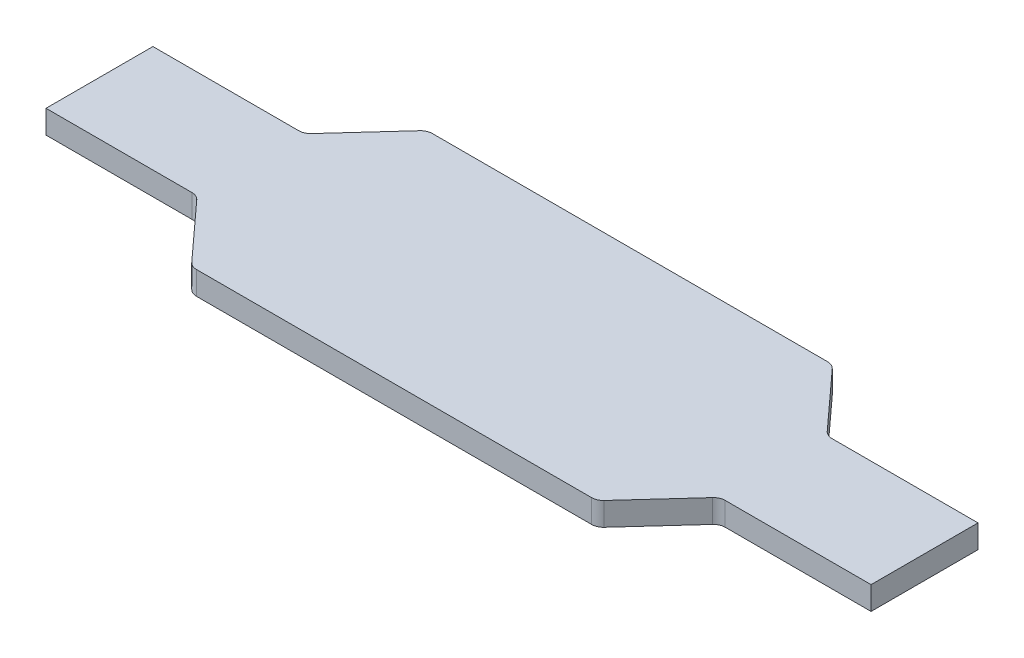
ISO-10303-21;
HEADER;
FILE_DESCRIPTION(('STEP AP214'),'2;1');
FILE_NAME('part.step','',(''),(''),'','','');
FILE_SCHEMA(('AUTOMOTIVE_DESIGN { 1 0 10303 214 1 1 1 1 }'));
ENDSEC;
DATA;
#1=APPLICATION_CONTEXT('core data for automotive mechanical design processes');
#2=APPLICATION_PROTOCOL_DEFINITION('international standard','automotive_design',2000,#1);
#3=PRODUCT_CONTEXT('',#1,'mechanical');
#4=PRODUCT('Part','Part','',(#3));
#5=PRODUCT_RELATED_PRODUCT_CATEGORY('part','',(#4));
#6=PRODUCT_DEFINITION_FORMATION('','',#4);
#7=PRODUCT_DEFINITION_CONTEXT('part definition',#1,'design');
#8=PRODUCT_DEFINITION('design','',#6,#7);
#9=PRODUCT_DEFINITION_SHAPE('','',#8);
#10=(LENGTH_UNIT() NAMED_UNIT(*) SI_UNIT(.MILLI.,.METRE.));
#11=(NAMED_UNIT(*) PLANE_ANGLE_UNIT() SI_UNIT($,.RADIAN.));
#12=(NAMED_UNIT(*) SI_UNIT($,.STERADIAN.) SOLID_ANGLE_UNIT());
#13=UNCERTAINTY_MEASURE_WITH_UNIT(LENGTH_MEASURE(1.E-05),#10,'distance_accuracy_value','');
#14=(GEOMETRIC_REPRESENTATION_CONTEXT(3) GLOBAL_UNCERTAINTY_ASSIGNED_CONTEXT((#13)) GLOBAL_UNIT_ASSIGNED_CONTEXT((#10,
#11,#12)) REPRESENTATION_CONTEXT('',''));
#15=CARTESIAN_POINT('',(0.,0.,0.));
#16=DIRECTION('',(0.,0.,1.));
#17=DIRECTION('',(1.,0.,0.));
#18=AXIS2_PLACEMENT_3D('',#15,#16,#17);
#19=CARTESIAN_POINT('',(-130.308370044053,10.,34.9855127088839));
#20=DIRECTION('',(0.,-1.,0.));
#21=DIRECTION('',(0.,0.,-1.));
#22=AXIS2_PLACEMENT_3D('',#19,#20,#21);
#23=CYLINDRICAL_SURFACE('',#22,4.99999999999999);
#24=CARTESIAN_POINT('',(-130.308370044053,0.,34.9855127088839));
#25=DIRECTION('',(0.,-1.,0.));
#26=DIRECTION('',(0.,0.,-1.));
#27=AXIS2_PLACEMENT_3D('',#24,#25,#26);
#28=CIRCLE('',#27,4.99999999999999);
#29=CARTESIAN_POINT('',(-130.308370044053,0.,39.9855127088839));
#30=VERTEX_POINT('',#29);
#31=CARTESIAN_POINT('',(-134.003500601569,0.,38.3538966185522));
#32=VERTEX_POINT('',#31);
#33=EDGE_CURVE('E215',#30,#32,#28,.T.);
#34=ORIENTED_EDGE('',*,*,#33,.F.);
#35=DIRECTION('',(0.,-1.,0.));
#36=VECTOR('',#35,1.);
#37=CARTESIAN_POINT('',(-130.308370044053,10.,39.9855127088839));
#38=LINE('',#37,#36);
#39=CARTESIAN_POINT('',(-130.308370044053,10.,39.9855127088839));
#40=VERTEX_POINT('',#39);
#41=EDGE_CURVE('E11',#40,#30,#38,.T.);
#42=ORIENTED_EDGE('',*,*,#41,.F.);
#43=CARTESIAN_POINT('',(-130.308370044053,10.,34.9855127088839));
#44=DIRECTION('',(0.,-1.,0.));
#45=DIRECTION('',(0.,0.,-1.));
#46=AXIS2_PLACEMENT_3D('',#43,#44,#45);
#47=CIRCLE('',#46,4.99999999999999);
#48=CARTESIAN_POINT('',(-134.003500601569,10.,38.3538966185522));
#49=VERTEX_POINT('',#48);
#50=EDGE_CURVE('E284',#40,#49,#47,.T.);
#51=ORIENTED_EDGE('',*,*,#50,.T.);
#52=DIRECTION('',(0.,-1.,0.));
#53=VECTOR('',#52,1.);
#54=CARTESIAN_POINT('',(-134.003500601569,10.,38.3538966185522));
#55=LINE('',#54,#53);
#56=EDGE_CURVE('E42',#49,#32,#55,.T.);
#57=ORIENTED_EDGE('',*,*,#56,.T.);
#58=EDGE_LOOP('',(#34,#42,#51,#57));
#59=FACE_BOUND('',#58,.T.);
#60=ADVANCED_FACE('F39',(#59),#23,.T.);
#61=CARTESIAN_POINT('',(-130.308370044053,10.,39.9855127088839));
#62=DIRECTION('',(0.,0.,-1.));
#63=DIRECTION('',(-1.,0.,0.));
#64=AXIS2_PLACEMENT_3D('',#61,#62,#63);
#65=PLANE('',#64);
#66=DIRECTION('',(1.,0.,0.));
#67=VECTOR('',#66,1.);
#68=CARTESIAN_POINT('',(-130.308370044053,0.,39.9855127088839));
#69=LINE('',#68,#67);
#70=CARTESIAN_POINT('',(39.6916299559471,0.,39.9855127088839));
#71=VERTEX_POINT('',#70);
#72=EDGE_CURVE('E121',#30,#71,#69,.T.);
#73=ORIENTED_EDGE('',*,*,#72,.T.);
#74=DIRECTION('',(0.,-1.,0.));
#75=VECTOR('',#74,1.);
#76=CARTESIAN_POINT('',(39.6916299559471,10.,39.9855127088839));
#77=LINE('',#76,#75);
#78=CARTESIAN_POINT('',(39.6916299559471,10.,39.9855127088839));
#79=VERTEX_POINT('',#78);
#80=EDGE_CURVE('E49',#79,#71,#77,.T.);
#81=ORIENTED_EDGE('',*,*,#80,.F.);
#82=DIRECTION('',(1.,0.,0.));
#83=VECTOR('',#82,1.);
#84=CARTESIAN_POINT('',(-130.308370044053,10.,39.9855127088839));
#85=LINE('',#84,#83);
#86=EDGE_CURVE('E188',#40,#79,#85,.T.);
#87=ORIENTED_EDGE('',*,*,#86,.F.);
#88=ORIENTED_EDGE('',*,*,#41,.T.);
#89=EDGE_LOOP('',(#73,#81,#87,#88));
#90=FACE_BOUND('',#89,.T.);
#91=ADVANCED_FACE('F470',(#90),#65,.F.);
#92=CARTESIAN_POINT('',(39.6916299559471,10.,34.9855127088839));
#93=DIRECTION('',(0.,-1.,0.));
#94=DIRECTION('',(0.,0.,-1.));
#95=AXIS2_PLACEMENT_3D('',#92,#93,#94);
#96=CYLINDRICAL_SURFACE('',#95,4.99999999999999);
#97=CARTESIAN_POINT('',(39.6916299559471,0.,34.9855127088839));
#98=DIRECTION('',(0.,1.,0.));
#99=DIRECTION('',(0.,0.,1.));
#100=AXIS2_PLACEMENT_3D('',#97,#98,#99);
#101=CIRCLE('',#100,4.99999999999999);
#102=CARTESIAN_POINT('',(43.386760513463,0.,38.3538966185523));
#103=VERTEX_POINT('',#102);
#104=EDGE_CURVE('E196',#71,#103,#101,.T.);
#105=ORIENTED_EDGE('',*,*,#104,.T.);
#106=DIRECTION('',(0.,-1.,0.));
#107=VECTOR('',#106,1.);
#108=CARTESIAN_POINT('',(43.386760513463,10.,38.3538966185523));
#109=LINE('',#108,#107);
#110=CARTESIAN_POINT('',(43.386760513463,10.,38.3538966185523));
#111=VERTEX_POINT('',#110);
#112=EDGE_CURVE('E193',#111,#103,#109,.T.);
#113=ORIENTED_EDGE('',*,*,#112,.F.);
#114=CARTESIAN_POINT('',(39.6916299559471,10.,34.9855127088839));
#115=DIRECTION('',(0.,1.,0.));
#116=DIRECTION('',(0.,0.,1.));
#117=AXIS2_PLACEMENT_3D('',#114,#115,#116);
#118=CIRCLE('',#117,4.99999999999999);
#119=EDGE_CURVE('E181',#79,#111,#118,.T.);
#120=ORIENTED_EDGE('',*,*,#119,.F.);
#121=ORIENTED_EDGE('',*,*,#80,.T.);
#122=EDGE_LOOP('',(#105,#113,#120,#121));
#123=FACE_BOUND('',#122,.T.);
#124=ADVANCED_FACE('F194',(#123),#96,.T.);
#125=CARTESIAN_POINT('',(43.386760513463,10.,38.3538966185522));
#126=DIRECTION('',(-0.739026111503173,0.,-0.673676781933665));
#127=DIRECTION('',(-0.673676781933665,0.,0.739026111503174));
#128=AXIS2_PLACEMENT_3D('',#125,#126,#127);
#129=PLANE('',#128);
#130=DIRECTION('',(0.673676781933665,0.,-0.739026111503173));
#131=VECTOR('',#130,1.);
#132=CARTESIAN_POINT('',(43.386760513463,0.,38.3538966185522));
#133=LINE('',#132,#131);
#134=CARTESIAN_POINT('',(65.6604900696769,0.,13.9195266297957));
#135=VERTEX_POINT('',#134);
#136=EDGE_CURVE('E278',#103,#135,#133,.T.);
#137=ORIENTED_EDGE('',*,*,#136,.T.);
#138=DIRECTION('',(0.,-1.,0.));
#139=VECTOR('',#138,1.);
#140=CARTESIAN_POINT('',(65.6604900696769,10.,13.9195266297957));
#141=LINE('',#140,#139);
#142=CARTESIAN_POINT('',(65.6604900696769,10.,13.9195266297957));
#143=VERTEX_POINT('',#142);
#144=EDGE_CURVE('E200',#143,#135,#141,.T.);
#145=ORIENTED_EDGE('',*,*,#144,.F.);
#146=DIRECTION('',(0.673676781933665,0.,-0.739026111503173));
#147=VECTOR('',#146,1.);
#148=CARTESIAN_POINT('',(43.386760513463,10.,38.3538966185522));
#149=LINE('',#148,#147);
#150=EDGE_CURVE('E186',#111,#143,#149,.T.);
#151=ORIENTED_EDGE('',*,*,#150,.F.);
#152=ORIENTED_EDGE('',*,*,#112,.T.);
#153=EDGE_LOOP('',(#137,#145,#151,#152));
#154=FACE_BOUND('',#153,.T.);
#155=ADVANCED_FACE('F202',(#154),#129,.F.);
#156=CARTESIAN_POINT('',(69.3556206271928,10.,17.287910539464));
#157=DIRECTION('',(0.,-1.,0.));
#158=DIRECTION('',(0.,0.,-1.));
#159=AXIS2_PLACEMENT_3D('',#156,#157,#158);
#160=CYLINDRICAL_SURFACE('',#159,5.00000000000001);
#161=CARTESIAN_POINT('',(69.3556206271928,0.,17.287910539464));
#162=DIRECTION('',(0.,-1.,0.));
#163=DIRECTION('',(0.,0.,-1.));
#164=AXIS2_PLACEMENT_3D('',#161,#162,#163);
#165=CIRCLE('',#164,5.00000000000001);
#166=CARTESIAN_POINT('',(69.3556206271928,0.,12.287910539464));
#167=VERTEX_POINT('',#166);
#168=EDGE_CURVE('E275',#135,#167,#165,.T.);
#169=ORIENTED_EDGE('',*,*,#168,.T.);
#170=DIRECTION('',(0.,-1.,0.));
#171=VECTOR('',#170,1.);
#172=CARTESIAN_POINT('',(69.3556206271928,10.,12.287910539464));
#173=LINE('',#172,#171);
#174=CARTESIAN_POINT('',(69.3556206271928,10.,12.287910539464));
#175=VERTEX_POINT('',#174);
#176=EDGE_CURVE('E290',#175,#167,#173,.T.);
#177=ORIENTED_EDGE('',*,*,#176,.F.);
#178=CARTESIAN_POINT('',(69.3556206271928,10.,17.287910539464));
#179=DIRECTION('',(0.,-1.,0.));
#180=DIRECTION('',(0.,0.,-1.));
#181=AXIS2_PLACEMENT_3D('',#178,#179,#180);
#182=CIRCLE('',#181,5.00000000000001);
#183=EDGE_CURVE('E206',#143,#175,#182,.T.);
#184=ORIENTED_EDGE('',*,*,#183,.F.);
#185=ORIENTED_EDGE('',*,*,#144,.T.);
#186=EDGE_LOOP('',(#169,#177,#184,#185));
#187=FACE_BOUND('',#186,.T.);
#188=ADVANCED_FACE('F346',(#187),#160,.F.);
#189=CARTESIAN_POINT('',(69.3556206271928,10.,12.287910539464));
#190=DIRECTION('',(0.,0.,-1.));
#191=DIRECTION('',(-1.,0.,0.));
#192=AXIS2_PLACEMENT_3D('',#189,#190,#191);
#193=PLANE('',#192);
#194=DIRECTION('',(1.,0.,0.));
#195=VECTOR('',#194,1.);
#196=CARTESIAN_POINT('',(69.3556206271928,0.,12.287910539464));
#197=LINE('',#196,#195);
#198=CARTESIAN_POINT('',(132.147828419401,0.,12.287910539464));
#199=VERTEX_POINT('',#198);
#200=EDGE_CURVE('E271',#167,#199,#197,.T.);
#201=ORIENTED_EDGE('',*,*,#200,.T.);
#202=DIRECTION('',(0.,-1.,0.));
#203=VECTOR('',#202,1.);
#204=CARTESIAN_POINT('',(132.147828419401,10.,12.287910539464));
#205=LINE('',#204,#203);
#206=CARTESIAN_POINT('',(132.147828419401,10.,12.287910539464));
#207=VERTEX_POINT('',#206);
#208=EDGE_CURVE('E294',#207,#199,#205,.T.);
#209=ORIENTED_EDGE('',*,*,#208,.F.);
#210=DIRECTION('',(1.,0.,0.));
#211=VECTOR('',#210,1.);
#212=CARTESIAN_POINT('',(69.3556206271928,10.,12.287910539464));
#213=LINE('',#212,#211);
#214=EDGE_CURVE('E209',#175,#207,#213,.T.);
#215=ORIENTED_EDGE('',*,*,#214,.F.);
#216=ORIENTED_EDGE('',*,*,#176,.T.);
#217=EDGE_LOOP('',(#201,#209,#215,#216));
#218=FACE_BOUND('',#217,.T.);
#219=ADVANCED_FACE('F357',(#218),#193,.F.);
#220=CARTESIAN_POINT('',(132.147828419401,10.,-33.712089460536));
#221=DIRECTION('',(1.,0.,0.));
#222=DIRECTION('',(0.,0.,-1.));
#223=AXIS2_PLACEMENT_3D('',#220,#221,#222);
#224=PLANE('',#223);
#225=DIRECTION('',(0.,0.,1.));
#226=VECTOR('',#225,1.);
#227=CARTESIAN_POINT('',(132.147828419401,0.,-33.712089460536));
#228=LINE('',#227,#226);
#229=CARTESIAN_POINT('',(132.147828419401,0.,-33.712089460536));
#230=VERTEX_POINT('',#229);
#231=EDGE_CURVE('E267',#230,#199,#228,.T.);
#232=ORIENTED_EDGE('',*,*,#231,.F.);
#233=DIRECTION('',(0.,-1.,0.));
#234=VECTOR('',#233,1.);
#235=CARTESIAN_POINT('',(132.147828419401,10.,-33.712089460536));
#236=LINE('',#235,#234);
#237=CARTESIAN_POINT('',(132.147828419401,10.,-33.712089460536));
#238=VERTEX_POINT('',#237);
#239=EDGE_CURVE('E297',#238,#230,#236,.T.);
#240=ORIENTED_EDGE('',*,*,#239,.F.);
#241=DIRECTION('',(0.,0.,1.));
#242=VECTOR('',#241,1.);
#243=CARTESIAN_POINT('',(132.147828419401,10.,-33.712089460536));
#244=LINE('',#243,#242);
#245=EDGE_CURVE('E353',#238,#207,#244,.T.);
#246=ORIENTED_EDGE('',*,*,#245,.T.);
#247=ORIENTED_EDGE('',*,*,#208,.T.);
#248=EDGE_LOOP('',(#232,#240,#246,#247));
#249=FACE_BOUND('',#248,.T.);
#250=ADVANCED_FACE('F360',(#249),#224,.T.);
#251=CARTESIAN_POINT('',(69.3556206271928,10.,-33.712089460536));
#252=DIRECTION('',(0.,0.,-1.));
#253=DIRECTION('',(-1.,0.,0.));
#254=AXIS2_PLACEMENT_3D('',#251,#252,#253);
#255=PLANE('',#254);
#256=DIRECTION('',(1.,0.,0.));
#257=VECTOR('',#256,1.);
#258=CARTESIAN_POINT('',(69.3556206271928,0.,-33.712089460536));
#259=LINE('',#258,#257);
#260=CARTESIAN_POINT('',(69.3556206271928,0.,-33.712089460536));
#261=VERTEX_POINT('',#260);
#262=EDGE_CURVE('E263',#261,#230,#259,.T.);
#263=ORIENTED_EDGE('',*,*,#262,.F.);
#264=DIRECTION('',(0.,-1.,0.));
#265=VECTOR('',#264,1.);
#266=CARTESIAN_POINT('',(69.3556206271928,10.,-33.712089460536));
#267=LINE('',#266,#265);
#268=CARTESIAN_POINT('',(69.3556206271928,10.,-33.712089460536));
#269=VERTEX_POINT('',#268);
#270=EDGE_CURVE('E300',#269,#261,#267,.T.);
#271=ORIENTED_EDGE('',*,*,#270,.F.);
#272=DIRECTION('',(1.,0.,0.));
#273=VECTOR('',#272,1.);
#274=CARTESIAN_POINT('',(69.3556206271928,10.,-33.712089460536));
#275=LINE('',#274,#273);
#276=EDGE_CURVE('E362',#269,#238,#275,.T.);
#277=ORIENTED_EDGE('',*,*,#276,.T.);
#278=ORIENTED_EDGE('',*,*,#239,.T.);
#279=EDGE_LOOP('',(#263,#271,#277,#278));
#280=FACE_BOUND('',#279,.T.);
#281=ADVANCED_FACE('F460',(#280),#255,.T.);
#282=CARTESIAN_POINT('',(69.3556206271928,10.,-38.712089460536));
#283=DIRECTION('',(0.,-1.,0.));
#284=DIRECTION('',(0.,0.,-1.));
#285=AXIS2_PLACEMENT_3D('',#282,#283,#284);
#286=CYLINDRICAL_SURFACE('',#285,5.00000000000001);
#287=CARTESIAN_POINT('',(69.3556206271928,0.,-38.712089460536));
#288=DIRECTION('',(0.,1.,0.));
#289=DIRECTION('',(0.,0.,1.));
#290=AXIS2_PLACEMENT_3D('',#287,#288,#289);
#291=CIRCLE('',#290,5.00000000000001);
#292=CARTESIAN_POINT('',(65.6604900696769,0.,-35.3437055508677));
#293=VERTEX_POINT('',#292);
#294=EDGE_CURVE('E259',#293,#261,#291,.T.);
#295=ORIENTED_EDGE('',*,*,#294,.F.);
#296=DIRECTION('',(0.,-1.,0.));
#297=VECTOR('',#296,1.);
#298=CARTESIAN_POINT('',(65.6604900696769,10.,-35.3437055508677));
#299=LINE('',#298,#297);
#300=CARTESIAN_POINT('',(65.6604900696769,10.,-35.3437055508677));
#301=VERTEX_POINT('',#300);
#302=EDGE_CURVE('E303',#301,#293,#299,.T.);
#303=ORIENTED_EDGE('',*,*,#302,.F.);
#304=CARTESIAN_POINT('',(69.3556206271928,10.,-38.712089460536));
#305=DIRECTION('',(0.,1.,0.));
#306=DIRECTION('',(0.,0.,1.));
#307=AXIS2_PLACEMENT_3D('',#304,#305,#306);
#308=CIRCLE('',#307,5.00000000000001);
#309=EDGE_CURVE('E365',#301,#269,#308,.T.);
#310=ORIENTED_EDGE('',*,*,#309,.T.);
#311=ORIENTED_EDGE('',*,*,#270,.T.);
#312=EDGE_LOOP('',(#295,#303,#310,#311));
#313=FACE_BOUND('',#312,.T.);
#314=ADVANCED_FACE('F457',(#313),#286,.F.);
#315=CARTESIAN_POINT('',(43.386760513463,10.,-59.7780755396243));
#316=DIRECTION('',(0.739026111503173,0.,-0.673676781933665));
#317=DIRECTION('',(-0.673676781933665,0.,-0.739026111503174));
#318=AXIS2_PLACEMENT_3D('',#315,#316,#317);
#319=PLANE('',#318);
#320=DIRECTION('',(0.673676781933665,0.,0.739026111503173));
#321=VECTOR('',#320,1.);
#322=CARTESIAN_POINT('',(43.386760513463,0.,-59.7780755396243));
#323=LINE('',#322,#321);
#324=CARTESIAN_POINT('',(43.386760513463,0.,-59.7780755396243));
#325=VERTEX_POINT('',#324);
#326=EDGE_CURVE('E255',#325,#293,#323,.T.);
#327=ORIENTED_EDGE('',*,*,#326,.F.);
#328=DIRECTION('',(0.,-1.,0.));
#329=VECTOR('',#328,1.);
#330=CARTESIAN_POINT('',(43.386760513463,10.,-59.7780755396243));
#331=LINE('',#330,#329);
#332=CARTESIAN_POINT('',(43.386760513463,10.,-59.7780755396243));
#333=VERTEX_POINT('',#332);
#334=EDGE_CURVE('E306',#333,#325,#331,.T.);
#335=ORIENTED_EDGE('',*,*,#334,.F.);
#336=DIRECTION('',(0.673676781933665,0.,0.739026111503173));
#337=VECTOR('',#336,1.);
#338=CARTESIAN_POINT('',(43.386760513463,10.,-59.7780755396243));
#339=LINE('',#338,#337);
#340=EDGE_CURVE('E371',#333,#301,#339,.T.);
#341=ORIENTED_EDGE('',*,*,#340,.T.);
#342=ORIENTED_EDGE('',*,*,#302,.T.);
#343=EDGE_LOOP('',(#327,#335,#341,#342));
#344=FACE_BOUND('',#343,.T.);
#345=ADVANCED_FACE('F453',(#344),#319,.T.);
#346=CARTESIAN_POINT('',(39.6916299559471,10.,-56.409691629956));
#347=DIRECTION('',(0.,-1.,0.));
#348=DIRECTION('',(0.,0.,-1.));
#349=AXIS2_PLACEMENT_3D('',#346,#347,#348);
#350=CYLINDRICAL_SURFACE('',#349,4.99999999999999);
#351=CARTESIAN_POINT('',(39.6916299559471,0.,-56.409691629956));
#352=DIRECTION('',(0.,-1.,0.));
#353=DIRECTION('',(0.,0.,-1.));
#354=AXIS2_PLACEMENT_3D('',#351,#352,#353);
#355=CIRCLE('',#354,4.99999999999999);
#356=CARTESIAN_POINT('',(39.6916299559471,0.,-61.409691629956));
#357=VERTEX_POINT('',#356);
#358=EDGE_CURVE('E251',#357,#325,#355,.T.);
#359=ORIENTED_EDGE('',*,*,#358,.F.);
#360=DIRECTION('',(0.,-1.,0.));
#361=VECTOR('',#360,1.);
#362=CARTESIAN_POINT('',(39.6916299559471,10.,-61.409691629956));
#363=LINE('',#362,#361);
#364=CARTESIAN_POINT('',(39.6916299559471,10.,-61.409691629956));
#365=VERTEX_POINT('',#364);
#366=EDGE_CURVE('E309',#365,#357,#363,.T.);
#367=ORIENTED_EDGE('',*,*,#366,.F.);
#368=CARTESIAN_POINT('',(39.6916299559471,10.,-56.409691629956));
#369=DIRECTION('',(0.,-1.,0.));
#370=DIRECTION('',(0.,0.,-1.));
#371=AXIS2_PLACEMENT_3D('',#368,#369,#370);
#372=CIRCLE('',#371,4.99999999999999);
#373=EDGE_CURVE('E375',#365,#333,#372,.T.);
#374=ORIENTED_EDGE('',*,*,#373,.T.);
#375=ORIENTED_EDGE('',*,*,#334,.T.);
#376=EDGE_LOOP('',(#359,#367,#374,#375));
#377=FACE_BOUND('',#376,.T.);
#378=ADVANCED_FACE('F449',(#377),#350,.T.);
#379=CARTESIAN_POINT('',(-130.308370044053,10.,-61.409691629956));
#380=DIRECTION('',(0.,0.,-1.));
#381=DIRECTION('',(-1.,0.,0.));
#382=AXIS2_PLACEMENT_3D('',#379,#380,#381);
#383=PLANE('',#382);
#384=DIRECTION('',(1.,0.,0.));
#385=VECTOR('',#384,1.);
#386=CARTESIAN_POINT('',(-130.308370044053,0.,-61.409691629956));
#387=LINE('',#386,#385);
#388=CARTESIAN_POINT('',(-130.308370044053,0.,-61.409691629956));
#389=VERTEX_POINT('',#388);
#390=EDGE_CURVE('E247',#389,#357,#387,.T.);
#391=ORIENTED_EDGE('',*,*,#390,.F.);
#392=DIRECTION('',(0.,-1.,0.));
#393=VECTOR('',#392,1.);
#394=CARTESIAN_POINT('',(-130.308370044053,10.,-61.409691629956));
#395=LINE('',#394,#393);
#396=CARTESIAN_POINT('',(-130.308370044053,10.,-61.409691629956));
#397=VERTEX_POINT('',#396);
#398=EDGE_CURVE('E312',#397,#389,#395,.T.);
#399=ORIENTED_EDGE('',*,*,#398,.F.);
#400=DIRECTION('',(1.,0.,0.));
#401=VECTOR('',#400,1.);
#402=CARTESIAN_POINT('',(-130.308370044053,10.,-61.409691629956));
#403=LINE('',#402,#401);
#404=EDGE_CURVE('E379',#397,#365,#403,.T.);
#405=ORIENTED_EDGE('',*,*,#404,.T.);
#406=ORIENTED_EDGE('',*,*,#366,.T.);
#407=EDGE_LOOP('',(#391,#399,#405,#406));
#408=FACE_BOUND('',#407,.T.);
#409=ADVANCED_FACE('F445',(#408),#383,.T.);
#410=CARTESIAN_POINT('',(-130.308370044053,10.,-56.409691629956));
#411=DIRECTION('',(0.,-1.,0.));
#412=DIRECTION('',(0.,0.,-1.));
#413=AXIS2_PLACEMENT_3D('',#410,#411,#412);
#414=CYLINDRICAL_SURFACE('',#413,4.99999999999999);
#415=CARTESIAN_POINT('',(-130.308370044053,0.,-56.409691629956));
#416=DIRECTION('',(0.,1.,0.));
#417=DIRECTION('',(0.,0.,1.));
#418=AXIS2_PLACEMENT_3D('',#415,#416,#417);
#419=CIRCLE('',#418,4.99999999999999);
#420=CARTESIAN_POINT('',(-134.003500601569,0.,-59.7780755396243));
#421=VERTEX_POINT('',#420);
#422=EDGE_CURVE('E244',#389,#421,#419,.T.);
#423=ORIENTED_EDGE('',*,*,#422,.T.);
#424=DIRECTION('',(0.,-1.,0.));
#425=VECTOR('',#424,1.);
#426=CARTESIAN_POINT('',(-134.003500601569,10.,-59.7780755396243));
#427=LINE('',#426,#425);
#428=CARTESIAN_POINT('',(-134.003500601569,10.,-59.7780755396243));
#429=VERTEX_POINT('',#428);
#430=EDGE_CURVE('E315',#429,#421,#427,.T.);
#431=ORIENTED_EDGE('',*,*,#430,.F.);
#432=CARTESIAN_POINT('',(-130.308370044053,10.,-56.409691629956));
#433=DIRECTION('',(0.,1.,0.));
#434=DIRECTION('',(0.,0.,1.));
#435=AXIS2_PLACEMENT_3D('',#432,#433,#434);
#436=CIRCLE('',#435,4.99999999999999);
#437=EDGE_CURVE('E383',#397,#429,#436,.T.);
#438=ORIENTED_EDGE('',*,*,#437,.F.);
#439=ORIENTED_EDGE('',*,*,#398,.T.);
#440=EDGE_LOOP('',(#423,#431,#438,#439));
#441=FACE_BOUND('',#440,.T.);
#442=ADVANCED_FACE('F441',(#441),#414,.T.);
#443=CARTESIAN_POINT('',(-134.003500601569,10.,-59.7780755396243));
#444=DIRECTION('',(0.739026111503174,0.,0.673676781933665));
#445=DIRECTION('',(0.673676781933665,0.,-0.739026111503174));
#446=AXIS2_PLACEMENT_3D('',#443,#444,#445);
#447=PLANE('',#446);
#448=DIRECTION('',(-0.673676781933665,0.,0.739026111503174));
#449=VECTOR('',#448,1.);
#450=CARTESIAN_POINT('',(-134.003500601569,0.,-59.7780755396243));
#451=LINE('',#450,#449);
#452=CARTESIAN_POINT('',(-156.277230157783,0.,-35.3437055508677));
#453=VERTEX_POINT('',#452);
#454=EDGE_CURVE('E241',#421,#453,#451,.T.);
#455=ORIENTED_EDGE('',*,*,#454,.T.);
#456=DIRECTION('',(0.,-1.,0.));
#457=VECTOR('',#456,1.);
#458=CARTESIAN_POINT('',(-156.277230157783,10.,-35.3437055508677));
#459=LINE('',#458,#457);
#460=CARTESIAN_POINT('',(-156.277230157783,10.,-35.3437055508677));
#461=VERTEX_POINT('',#460);
#462=EDGE_CURVE('E319',#461,#453,#459,.T.);
#463=ORIENTED_EDGE('',*,*,#462,.F.);
#464=DIRECTION('',(-0.673676781933665,0.,0.739026111503174));
#465=VECTOR('',#464,1.);
#466=CARTESIAN_POINT('',(-134.003500601569,10.,-59.7780755396243));
#467=LINE('',#466,#465);
#468=EDGE_CURVE('E386',#429,#461,#467,.T.);
#469=ORIENTED_EDGE('',*,*,#468,.F.);
#470=ORIENTED_EDGE('',*,*,#430,.T.);
#471=EDGE_LOOP('',(#455,#463,#469,#470));
#472=FACE_BOUND('',#471,.T.);
#473=ADVANCED_FACE('F437',(#472),#447,.F.);
#474=CARTESIAN_POINT('',(-159.972360715299,10.,-38.712089460536));
#475=DIRECTION('',(0.,-1.,0.));
#476=DIRECTION('',(0.,0.,-1.));
#477=AXIS2_PLACEMENT_3D('',#474,#475,#476);
#478=CYLINDRICAL_SURFACE('',#477,5.00000000000002);
#479=CARTESIAN_POINT('',(-159.972360715299,0.,-38.712089460536));
#480=DIRECTION('',(0.,-1.,0.));
#481=DIRECTION('',(0.,0.,-1.));
#482=AXIS2_PLACEMENT_3D('',#479,#480,#481);
#483=CIRCLE('',#482,5.00000000000002);
#484=CARTESIAN_POINT('',(-159.972360715299,0.,-33.712089460536));
#485=VERTEX_POINT('',#484);
#486=EDGE_CURVE('E238',#453,#485,#483,.T.);
#487=ORIENTED_EDGE('',*,*,#486,.T.);
#488=DIRECTION('',(0.,-1.,0.));
#489=VECTOR('',#488,1.);
#490=CARTESIAN_POINT('',(-159.972360715299,10.,-33.712089460536));
#491=LINE('',#490,#489);
#492=CARTESIAN_POINT('',(-159.972360715299,10.,-33.712089460536));
#493=VERTEX_POINT('',#492);
#494=EDGE_CURVE('E323',#493,#485,#491,.T.);
#495=ORIENTED_EDGE('',*,*,#494,.F.);
#496=CARTESIAN_POINT('',(-159.972360715299,10.,-38.712089460536));
#497=DIRECTION('',(0.,-1.,0.));
#498=DIRECTION('',(0.,0.,-1.));
#499=AXIS2_PLACEMENT_3D('',#496,#497,#498);
#500=CIRCLE('',#499,5.00000000000002);
#501=EDGE_CURVE('E389',#461,#493,#500,.T.);
#502=ORIENTED_EDGE('',*,*,#501,.F.);
#503=ORIENTED_EDGE('',*,*,#462,.T.);
#504=EDGE_LOOP('',(#487,#495,#502,#503));
#505=FACE_BOUND('',#504,.T.);
#506=ADVANCED_FACE('F432',(#505),#478,.F.);
#507=CARTESIAN_POINT('',(-159.972360715299,10.,-33.712089460536));
#508=DIRECTION('',(0.,0.,1.));
#509=DIRECTION('',(1.,0.,0.));
#510=AXIS2_PLACEMENT_3D('',#507,#508,#509);
#511=PLANE('',#510);
#512=DIRECTION('',(-1.,0.,0.));
#513=VECTOR('',#512,1.);
#514=CARTESIAN_POINT('',(-159.972360715299,0.,-33.712089460536));
#515=LINE('',#514,#513);
#516=CARTESIAN_POINT('',(-222.764568507506,0.,-33.712089460536));
#517=VERTEX_POINT('',#516);
#518=EDGE_CURVE('E235',#485,#517,#515,.T.);
#519=ORIENTED_EDGE('',*,*,#518,.T.);
#520=DIRECTION('',(0.,-1.,0.));
#521=VECTOR('',#520,1.);
#522=CARTESIAN_POINT('',(-222.764568507506,10.,-33.712089460536));
#523=LINE('',#522,#521);
#524=CARTESIAN_POINT('',(-222.764568507506,10.,-33.712089460536));
#525=VERTEX_POINT('',#524);
#526=EDGE_CURVE('E327',#525,#517,#523,.T.);
#527=ORIENTED_EDGE('',*,*,#526,.F.);
#528=DIRECTION('',(-1.,0.,0.));
#529=VECTOR('',#528,1.);
#530=CARTESIAN_POINT('',(-159.972360715299,10.,-33.712089460536));
#531=LINE('',#530,#529);
#532=EDGE_CURVE('E392',#493,#525,#531,.T.);
#533=ORIENTED_EDGE('',*,*,#532,.F.);
#534=ORIENTED_EDGE('',*,*,#494,.T.);
#535=EDGE_LOOP('',(#519,#527,#533,#534));
#536=FACE_BOUND('',#535,.T.);
#537=ADVANCED_FACE('F426',(#536),#511,.F.);
#538=CARTESIAN_POINT('',(-222.764568507506,10.,-33.712089460536));
#539=DIRECTION('',(1.,0.,0.));
#540=DIRECTION('',(0.,0.,-1.));
#541=AXIS2_PLACEMENT_3D('',#538,#539,#540);
#542=PLANE('',#541);
#543=DIRECTION('',(0.,0.,1.));
#544=VECTOR('',#543,1.);
#545=CARTESIAN_POINT('',(-222.764568507506,0.,-33.712089460536));
#546=LINE('',#545,#544);
#547=CARTESIAN_POINT('',(-222.764568507506,0.,12.287910539464));
#548=VERTEX_POINT('',#547);
#549=EDGE_CURVE('E231',#517,#548,#546,.T.);
#550=ORIENTED_EDGE('',*,*,#549,.T.);
#551=DIRECTION('',(0.,-1.,0.));
#552=VECTOR('',#551,1.);
#553=CARTESIAN_POINT('',(-222.764568507506,10.,12.287910539464));
#554=LINE('',#553,#552);
#555=CARTESIAN_POINT('',(-222.764568507506,10.,12.287910539464));
#556=VERTEX_POINT('',#555);
#557=EDGE_CURVE('E331',#556,#548,#554,.T.);
#558=ORIENTED_EDGE('',*,*,#557,.F.);
#559=DIRECTION('',(0.,0.,1.));
#560=VECTOR('',#559,1.);
#561=CARTESIAN_POINT('',(-222.764568507506,10.,-33.712089460536));
#562=LINE('',#561,#560);
#563=EDGE_CURVE('E395',#525,#556,#562,.T.);
#564=ORIENTED_EDGE('',*,*,#563,.F.);
#565=ORIENTED_EDGE('',*,*,#526,.T.);
#566=EDGE_LOOP('',(#550,#558,#564,#565));
#567=FACE_BOUND('',#566,.T.);
#568=ADVANCED_FACE('F422',(#567),#542,.F.);
#569=CARTESIAN_POINT('',(-159.972360715299,10.,12.287910539464));
#570=DIRECTION('',(0.,0.,1.));
#571=DIRECTION('',(1.,0.,0.));
#572=AXIS2_PLACEMENT_3D('',#569,#570,#571);
#573=PLANE('',#572);
#574=DIRECTION('',(-1.,0.,0.));
#575=VECTOR('',#574,1.);
#576=CARTESIAN_POINT('',(-159.972360715299,0.,12.287910539464));
#577=LINE('',#576,#575);
#578=CARTESIAN_POINT('',(-159.972360715299,0.,12.287910539464));
#579=VERTEX_POINT('',#578);
#580=EDGE_CURVE('E227',#579,#548,#577,.T.);
#581=ORIENTED_EDGE('',*,*,#580,.F.);
#582=DIRECTION('',(0.,-1.,0.));
#583=VECTOR('',#582,1.);
#584=CARTESIAN_POINT('',(-159.972360715299,10.,12.287910539464));
#585=LINE('',#584,#583);
#586=CARTESIAN_POINT('',(-159.972360715299,10.,12.287910539464));
#587=VERTEX_POINT('',#586);
#588=EDGE_CURVE('E334',#587,#579,#585,.T.);
#589=ORIENTED_EDGE('',*,*,#588,.F.);
#590=DIRECTION('',(-1.,0.,0.));
#591=VECTOR('',#590,1.);
#592=CARTESIAN_POINT('',(-159.972360715299,10.,12.287910539464));
#593=LINE('',#592,#591);
#594=EDGE_CURVE('E398',#587,#556,#593,.T.);
#595=ORIENTED_EDGE('',*,*,#594,.T.);
#596=ORIENTED_EDGE('',*,*,#557,.T.);
#597=EDGE_LOOP('',(#581,#589,#595,#596));
#598=FACE_BOUND('',#597,.T.);
#599=ADVANCED_FACE('F418',(#598),#573,.T.);
#600=CARTESIAN_POINT('',(-159.972360715299,10.,17.287910539464));
#601=DIRECTION('',(0.,-1.,0.));
#602=DIRECTION('',(0.,0.,-1.));
#603=AXIS2_PLACEMENT_3D('',#600,#601,#602);
#604=CYLINDRICAL_SURFACE('',#603,5.00000000000002);
#605=CARTESIAN_POINT('',(-159.972360715299,0.,17.287910539464));
#606=DIRECTION('',(0.,1.,0.));
#607=DIRECTION('',(0.,0.,1.));
#608=AXIS2_PLACEMENT_3D('',#605,#606,#607);
#609=CIRCLE('',#608,5.00000000000002);
#610=CARTESIAN_POINT('',(-156.277230157783,0.,13.9195266297957));
#611=VERTEX_POINT('',#610);
#612=EDGE_CURVE('E223',#611,#579,#609,.T.);
#613=ORIENTED_EDGE('',*,*,#612,.F.);
#614=DIRECTION('',(0.,-1.,0.));
#615=VECTOR('',#614,1.);
#616=CARTESIAN_POINT('',(-156.277230157783,10.,13.9195266297957));
#617=LINE('',#616,#615);
#618=CARTESIAN_POINT('',(-156.277230157783,10.,13.9195266297957));
#619=VERTEX_POINT('',#618);
#620=EDGE_CURVE('E336',#619,#611,#617,.T.);
#621=ORIENTED_EDGE('',*,*,#620,.F.);
#622=CARTESIAN_POINT('',(-159.972360715299,10.,17.287910539464));
#623=DIRECTION('',(0.,1.,0.));
#624=DIRECTION('',(0.,0.,1.));
#625=AXIS2_PLACEMENT_3D('',#622,#623,#624);
#626=CIRCLE('',#625,5.00000000000002);
#627=EDGE_CURVE('E402',#619,#587,#626,.T.);
#628=ORIENTED_EDGE('',*,*,#627,.T.);
#629=ORIENTED_EDGE('',*,*,#588,.T.);
#630=EDGE_LOOP('',(#613,#621,#628,#629));
#631=FACE_BOUND('',#630,.T.);
#632=ADVANCED_FACE('F413',(#631),#604,.F.);
#633=CARTESIAN_POINT('',(-134.003500601569,10.,38.3538966185522));
#634=DIRECTION('',(-0.739026111503174,0.,0.673676781933665));
#635=DIRECTION('',(0.673676781933665,0.,0.739026111503174));
#636=AXIS2_PLACEMENT_3D('',#633,#634,#635);
#637=PLANE('',#636);
#638=DIRECTION('',(-0.673676781933665,0.,-0.739026111503174));
#639=VECTOR('',#638,1.);
#640=CARTESIAN_POINT('',(-134.003500601569,0.,38.3538966185522));
#641=LINE('',#640,#639);
#642=EDGE_CURVE('E219',#32,#611,#641,.T.);
#643=ORIENTED_EDGE('',*,*,#642,.F.);
#644=ORIENTED_EDGE('',*,*,#56,.F.);
#645=DIRECTION('',(-0.673676781933665,0.,-0.739026111503174));
#646=VECTOR('',#645,1.);
#647=CARTESIAN_POINT('',(-134.003500601569,10.,38.3538966185522));
#648=LINE('',#647,#646);
#649=EDGE_CURVE('E406',#49,#619,#648,.T.);
#650=ORIENTED_EDGE('',*,*,#649,.T.);
#651=ORIENTED_EDGE('',*,*,#620,.T.);
#652=EDGE_LOOP('',(#643,#644,#650,#651));
#653=FACE_BOUND('',#652,.T.);
#654=ADVANCED_FACE('F340',(#653),#637,.T.);
#655=CARTESIAN_POINT('',(-130.308370044053,10.,34.9855127088839));
#656=DIRECTION('',(0.,-1.,0.));
#657=DIRECTION('',(0.,0.,-1.));
#658=AXIS2_PLACEMENT_3D('',#655,#656,#657);
#659=PLANE('',#658);
#660=ORIENTED_EDGE('',*,*,#50,.F.);
#661=ORIENTED_EDGE('',*,*,#86,.T.);
#662=ORIENTED_EDGE('',*,*,#119,.T.);
#663=ORIENTED_EDGE('',*,*,#150,.T.);
#664=ORIENTED_EDGE('',*,*,#183,.T.);
#665=ORIENTED_EDGE('',*,*,#214,.T.);
#666=ORIENTED_EDGE('',*,*,#245,.F.);
#667=ORIENTED_EDGE('',*,*,#276,.F.);
#668=ORIENTED_EDGE('',*,*,#309,.F.);
#669=ORIENTED_EDGE('',*,*,#340,.F.);
#670=ORIENTED_EDGE('',*,*,#373,.F.);
#671=ORIENTED_EDGE('',*,*,#404,.F.);
#672=ORIENTED_EDGE('',*,*,#437,.T.);
#673=ORIENTED_EDGE('',*,*,#468,.T.);
#674=ORIENTED_EDGE('',*,*,#501,.T.);
#675=ORIENTED_EDGE('',*,*,#532,.T.);
#676=ORIENTED_EDGE('',*,*,#563,.T.);
#677=ORIENTED_EDGE('',*,*,#594,.F.);
#678=ORIENTED_EDGE('',*,*,#627,.F.);
#679=ORIENTED_EDGE('',*,*,#649,.F.);
#680=EDGE_LOOP('',(#660,#661,#662,#663,#664,#665,#666,#667,#668,#669,#670,#671,#672,#673,#674,
#675,#676,#677,#678,#679));
#681=FACE_BOUND('',#680,.T.);
#682=ADVANCED_FACE('F184',(#681),#659,.F.);
#683=CARTESIAN_POINT('',(-130.308370044053,0.,34.9855127088839));
#684=DIRECTION('',(0.,-1.,0.));
#685=DIRECTION('',(0.,0.,-1.));
#686=AXIS2_PLACEMENT_3D('',#683,#684,#685);
#687=PLANE('',#686);
#688=ORIENTED_EDGE('',*,*,#33,.T.);
#689=ORIENTED_EDGE('',*,*,#642,.T.);
#690=ORIENTED_EDGE('',*,*,#612,.T.);
#691=ORIENTED_EDGE('',*,*,#580,.T.);
#692=ORIENTED_EDGE('',*,*,#549,.F.);
#693=ORIENTED_EDGE('',*,*,#518,.F.);
#694=ORIENTED_EDGE('',*,*,#486,.F.);
#695=ORIENTED_EDGE('',*,*,#454,.F.);
#696=ORIENTED_EDGE('',*,*,#422,.F.);
#697=ORIENTED_EDGE('',*,*,#390,.T.);
#698=ORIENTED_EDGE('',*,*,#358,.T.);
#699=ORIENTED_EDGE('',*,*,#326,.T.);
#700=ORIENTED_EDGE('',*,*,#294,.T.);
#701=ORIENTED_EDGE('',*,*,#262,.T.);
#702=ORIENTED_EDGE('',*,*,#231,.T.);
#703=ORIENTED_EDGE('',*,*,#200,.F.);
#704=ORIENTED_EDGE('',*,*,#168,.F.);
#705=ORIENTED_EDGE('',*,*,#136,.F.);
#706=ORIENTED_EDGE('',*,*,#104,.F.);
#707=ORIENTED_EDGE('',*,*,#72,.F.);
#708=EDGE_LOOP('',(#688,#689,#690,#691,#692,#693,#694,#695,#696,#697,#698,#699,#700,#701,#702,
#703,#704,#705,#706,#707));
#709=FACE_BOUND('',#708,.T.);
#710=ADVANCED_FACE('F342',(#709),#687,.T.);
#711=CLOSED_SHELL('',(#60,#91,#124,#155,#188,#219,#250,#281,#314,#345,#378,#409,#442,#473,#506,
#537,#568,#599,#632,#654,#682,#710));
#712=MANIFOLD_SOLID_BREP('B2',#711);
#713=ADVANCED_BREP_SHAPE_REPRESENTATION('',(#18,#712),#14);
#714=SHAPE_DEFINITION_REPRESENTATION(#9,#713);
ENDSEC;
END-ISO-10303-21;
